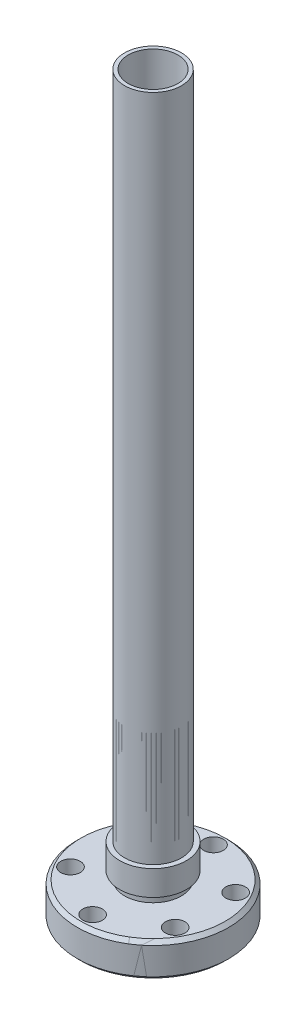
ISO-10303-21;
HEADER;
FILE_DESCRIPTION(('STEP AP214'),'2;1');
FILE_NAME('part.step','',(''),(''),'','','');
FILE_SCHEMA(('AUTOMOTIVE_DESIGN { 1 0 10303 214 1 1 1 1 }'));
ENDSEC;
DATA;
#1=APPLICATION_CONTEXT('core data for automotive mechanical design processes');
#2=APPLICATION_PROTOCOL_DEFINITION('international standard','automotive_design',2000,#1);
#3=PRODUCT_CONTEXT('',#1,'mechanical');
#4=PRODUCT('Part','Part','',(#3));
#5=PRODUCT_RELATED_PRODUCT_CATEGORY('part','',(#4));
#6=PRODUCT_DEFINITION_FORMATION('','',#4);
#7=PRODUCT_DEFINITION_CONTEXT('part definition',#1,'design');
#8=PRODUCT_DEFINITION('design','',#6,#7);
#9=PRODUCT_DEFINITION_SHAPE('','',#8);
#10=(LENGTH_UNIT() NAMED_UNIT(*) SI_UNIT(.MILLI.,.METRE.));
#11=(NAMED_UNIT(*) PLANE_ANGLE_UNIT() SI_UNIT($,.RADIAN.));
#12=(NAMED_UNIT(*) SI_UNIT($,.STERADIAN.) SOLID_ANGLE_UNIT());
#13=UNCERTAINTY_MEASURE_WITH_UNIT(LENGTH_MEASURE(1.E-05),#10,'distance_accuracy_value','');
#14=(GEOMETRIC_REPRESENTATION_CONTEXT(3) GLOBAL_UNCERTAINTY_ASSIGNED_CONTEXT((#13)) GLOBAL_UNIT_ASSIGNED_CONTEXT((#10,
#11,#12)) REPRESENTATION_CONTEXT('',''));
#15=CARTESIAN_POINT('',(0.,0.,0.));
#16=DIRECTION('',(0.,0.,1.));
#17=DIRECTION('',(1.,0.,0.));
#18=AXIS2_PLACEMENT_3D('',#15,#16,#17);
#19=CARTESIAN_POINT('',(0.,164.2364,1.72028497727633E-12));
#20=DIRECTION('',(0.,-1.,0.));
#21=DIRECTION('',(-1.,0.,0.));
#22=AXIS2_PLACEMENT_3D('',#19,#20,#21);
#23=CYLINDRICAL_SURFACE('',#22,6.35);
#24=CARTESIAN_POINT('',(0.,15.0114,1.57236068909729E-13));
#25=DIRECTION('',(0.,1.,0.));
#26=DIRECTION('',(0.,0.,1.));
#27=AXIS2_PLACEMENT_3D('',#24,#25,#26);
#28=CIRCLE('',#27,6.35);
#29=CARTESIAN_POINT('',(0.,15.0114,6.35000000000016));
#30=VERTEX_POINT('',#29);
#31=EDGE_CURVE('P0_E13',#30,#30,#28,.T.);
#32=ORIENTED_EDGE('',*,*,#31,.T.);
#33=EDGE_LOOP('',(#32));
#34=FACE_BOUND('',#33,.T.);
#35=CARTESIAN_POINT('',(0.,40.4114,4.23286946929577E-13));
#36=DIRECTION('',(0.,1.,0.));
#37=DIRECTION('',(0.,0.,1.));
#38=AXIS2_PLACEMENT_3D('',#35,#36,#37);
#39=CIRCLE('',#38,6.35);
#40=CARTESIAN_POINT('',(0.,40.4114,6.35000000000042));
#41=VERTEX_POINT('',#40);
#42=EDGE_CURVE('P0_E206',#41,#41,#39,.F.);
#43=ORIENTED_EDGE('',*,*,#42,.T.);
#44=EDGE_LOOP('',(#43));
#45=FACE_BOUND('',#44,.T.);
#46=ADVANCED_FACE('P0_F52',(#34,#45),#23,.T.);
#47=CARTESIAN_POINT('',(0.,164.2364,1.72028497727633E-12));
#48=DIRECTION('',(0.,-1.,0.));
#49=DIRECTION('',(-1.,0.,0.));
#50=AXIS2_PLACEMENT_3D('',#47,#48,#49);
#51=CYLINDRICAL_SURFACE('',#50,5.5372);
#52=CARTESIAN_POINT('',(0.,11.8364,1.23979709157249E-13));
#53=DIRECTION('',(0.,1.,0.));
#54=DIRECTION('',(1.,0.,0.));
#55=AXIS2_PLACEMENT_3D('',#52,#53,#54);
#56=CIRCLE('',#55,5.5372);
#57=CARTESIAN_POINT('',(5.5372,11.8364,1.23979709157249E-13));
#58=VERTEX_POINT('',#57);
#59=EDGE_CURVE('P0_E225',#58,#58,#56,.T.);
#60=ORIENTED_EDGE('',*,*,#59,.F.);
#61=EDGE_LOOP('',(#60));
#62=FACE_BOUND('',#61,.T.);
#63=CARTESIAN_POINT('',(0.,40.4114,4.23286946929577E-13));
#64=DIRECTION('',(0.,1.,0.));
#65=DIRECTION('',(0.,0.,1.));
#66=AXIS2_PLACEMENT_3D('',#63,#64,#65);
#67=CIRCLE('',#66,5.5372);
#68=CARTESIAN_POINT('',(0.,40.4114,5.53720000000042));
#69=VERTEX_POINT('',#68);
#70=EDGE_CURVE('P0_E56',#69,#69,#67,.F.);
#71=ORIENTED_EDGE('',*,*,#70,.F.);
#72=EDGE_LOOP('',(#71));
#73=FACE_BOUND('',#72,.T.);
#74=ADVANCED_FACE('P0_F326',(#62,#73),#51,.F.);
#75=CARTESIAN_POINT('',(6.4135,15.0114,0.));
#76=DIRECTION('',(0.,1.,0.));
#77=DIRECTION('',(1.,0.,0.));
#78=AXIS2_PLACEMENT_3D('',#75,#76,#77);
#79=PLANE('',#78);
#80=CARTESIAN_POINT('',(0.,15.0114,0.));
#81=DIRECTION('',(0.,1.,0.));
#82=DIRECTION('',(0.,0.,1.));
#83=AXIS2_PLACEMENT_3D('',#80,#81,#82);
#84=CIRCLE('',#83,7.4295);
#85=CARTESIAN_POINT('',(0.,15.0114,7.4295));
#86=VERTEX_POINT('',#85);
#87=EDGE_CURVE('P0_E63',#86,#86,#84,.T.);
#88=ORIENTED_EDGE('',*,*,#87,.T.);
#89=EDGE_LOOP('',(#88));
#90=FACE_BOUND('',#89,.T.);
#91=ORIENTED_EDGE('',*,*,#31,.F.);
#92=EDGE_LOOP('',(#91));
#93=FACE_BOUND('',#92,.T.);
#94=ADVANCED_FACE('P0_F332',(#90,#93),#79,.T.);
#95=CARTESIAN_POINT('',(0.,36.0251993233018,0.));
#96=DIRECTION('',(0.,-1.,0.));
#97=DIRECTION('',(0.,0.,-1.));
#98=AXIS2_PLACEMENT_3D('',#95,#96,#97);
#99=CYLINDRICAL_SURFACE('',#98,7.4295);
#100=CARTESIAN_POINT('',(0.,9.4234,0.));
#101=DIRECTION('',(0.,-1.,0.));
#102=DIRECTION('',(0.,0.,-1.));
#103=AXIS2_PLACEMENT_3D('',#100,#101,#102);
#104=CIRCLE('',#103,7.4295);
#105=CARTESIAN_POINT('',(0.,9.4234,-7.4295));
#106=VERTEX_POINT('',#105);
#107=EDGE_CURVE('P0_E200',#106,#106,#104,.T.);
#108=ORIENTED_EDGE('',*,*,#107,.F.);
#109=EDGE_LOOP('',(#108));
#110=FACE_BOUND('',#109,.T.);
#111=ORIENTED_EDGE('',*,*,#87,.F.);
#112=EDGE_LOOP('',(#111));
#113=FACE_BOUND('',#112,.T.);
#114=ADVANCED_FACE('P0_F201',(#110,#113),#99,.T.);
#115=CARTESIAN_POINT('',(5.3975,11.8364,0.));
#116=DIRECTION('',(0.,1.,0.));
#117=DIRECTION('',(1.,0.,0.));
#118=AXIS2_PLACEMENT_3D('',#115,#116,#117);
#119=PLANE('',#118);
#120=ORIENTED_EDGE('',*,*,#59,.T.);
#121=EDGE_LOOP('',(#120));
#122=FACE_BOUND('',#121,.T.);
#123=CARTESIAN_POINT('',(0.,11.8364,0.));
#124=DIRECTION('',(0.,-1.,0.));
#125=DIRECTION('',(0.,0.,-1.));
#126=AXIS2_PLACEMENT_3D('',#123,#124,#125);
#127=CIRCLE('',#126,5.3975);
#128=CARTESIAN_POINT('',(0.,11.8364,-5.3975));
#129=VERTEX_POINT('',#128);
#130=EDGE_CURVE('P0_E224',#129,#129,#127,.T.);
#131=ORIENTED_EDGE('',*,*,#130,.T.);
#132=EDGE_LOOP('',(#131));
#133=FACE_BOUND('',#132,.T.);
#134=ADVANCED_FACE('P0_F339',(#122,#133),#119,.T.);
#135=CARTESIAN_POINT('',(0.,-8.49931016623051,0.));
#136=DIRECTION('',(0.,-1.,0.));
#137=DIRECTION('',(0.,0.,-1.));
#138=AXIS2_PLACEMENT_3D('',#135,#136,#137);
#139=CYLINDRICAL_SURFACE('',#138,9.144);
#140=CARTESIAN_POINT('',(0.,0.6604,0.));
#141=DIRECTION('',(0.,-1.,0.));
#142=DIRECTION('',(0.,0.,-1.));
#143=AXIS2_PLACEMENT_3D('',#140,#141,#142);
#144=CIRCLE('',#143,9.144);
#145=CARTESIAN_POINT('',(0.,0.6604,-9.144));
#146=VERTEX_POINT('',#145);
#147=EDGE_CURVE('P0_E220',#146,#146,#144,.T.);
#148=ORIENTED_EDGE('',*,*,#147,.T.);
#149=EDGE_LOOP('',(#148));
#150=FACE_BOUND('',#149,.T.);
#151=CARTESIAN_POINT('',(0.,1.1684,0.));
#152=DIRECTION('',(0.,-1.,0.));
#153=DIRECTION('',(0.,0.,-1.));
#154=AXIS2_PLACEMENT_3D('',#151,#152,#153);
#155=CIRCLE('',#154,9.144);
#156=CARTESIAN_POINT('',(0.,1.1684,-9.144));
#157=VERTEX_POINT('',#156);
#158=EDGE_CURVE('P0_E263',#157,#157,#155,.T.);
#159=ORIENTED_EDGE('',*,*,#158,.F.);
#160=EDGE_LOOP('',(#159));
#161=FACE_BOUND('',#160,.T.);
#162=ADVANCED_FACE('P0_F341',(#150,#161),#139,.F.);
#163=CARTESIAN_POINT('',(0.,1.22433548097206,0.));
#164=DIRECTION('',(0.,1.,0.));
#165=DIRECTION('',(0.,0.,1.));
#166=AXIS2_PLACEMENT_3D('',#163,#164,#165);
#167=CONICAL_SURFACE('',#166,10.6934,1.22173047639603);
#168=CARTESIAN_POINT('',(0.,1.22433548097206,0.));
#169=DIRECTION('',(0.,-1.,0.));
#170=DIRECTION('',(0.,0.,-1.));
#171=AXIS2_PLACEMENT_3D('',#168,#169,#170);
#172=CIRCLE('',#171,10.6934);
#173=CARTESIAN_POINT('',(0.,1.22433548097206,-10.6934));
#174=VERTEX_POINT('',#173);
#175=EDGE_CURVE('P0_E154',#174,#174,#172,.T.);
#176=ORIENTED_EDGE('',*,*,#175,.T.);
#177=EDGE_LOOP('',(#176));
#178=FACE_BOUND('',#177,.T.);
#179=ORIENTED_EDGE('',*,*,#147,.F.);
#180=EDGE_LOOP('',(#179));
#181=FACE_BOUND('',#180,.T.);
#182=ADVANCED_FACE('P0_F408',(#178,#181),#167,.T.);
#183=CARTESIAN_POINT('',(0.,-8.49931016623051,0.));
#184=DIRECTION('',(0.,-1.,0.));
#185=DIRECTION('',(0.,0.,-1.));
#186=AXIS2_PLACEMENT_3D('',#183,#184,#185);
#187=CYLINDRICAL_SURFACE('',#186,10.6934);
#188=CARTESIAN_POINT('',(0.,0.,0.));
#189=DIRECTION('',(0.,-1.,0.));
#190=DIRECTION('',(0.,0.,-1.));
#191=AXIS2_PLACEMENT_3D('',#188,#189,#190);
#192=CIRCLE('',#191,10.6934);
#193=CARTESIAN_POINT('',(0.,0.,-10.6934));
#194=VERTEX_POINT('',#193);
#195=EDGE_CURVE('P0_E163',#194,#194,#192,.T.);
#196=ORIENTED_EDGE('',*,*,#195,.T.);
#197=EDGE_LOOP('',(#196));
#198=FACE_BOUND('',#197,.T.);
#199=ORIENTED_EDGE('',*,*,#175,.F.);
#200=EDGE_LOOP('',(#199));
#201=FACE_BOUND('',#200,.T.);
#202=ADVANCED_FACE('P0_F371',(#198,#201),#187,.F.);
#203=CARTESIAN_POINT('',(-10.6934,0.,0.));
#204=DIRECTION('',(0.,1.,0.));
#205=DIRECTION('',(1.,0.,0.));
#206=AXIS2_PLACEMENT_3D('',#203,#204,#205);
#207=PLANE('',#206);
#208=CARTESIAN_POINT('',(0.,0.,0.));
#209=DIRECTION('',(0.,-1.,0.));
#210=DIRECTION('',(0.,0.,1.));
#211=AXIS2_PLACEMENT_3D('',#208,#209,#210);
#212=CIRCLE('',#211,16.1036);
#213=CARTESIAN_POINT('',(0.,0.,16.1036));
#214=VERTEX_POINT('',#213);
#215=EDGE_CURVE('P0_E239',#214,#214,#212,.T.);
#216=ORIENTED_EDGE('',*,*,#215,.T.);
#217=EDGE_LOOP('',(#216));
#218=FACE_BOUND('',#217,.T.);
#219=CARTESIAN_POINT('',(11.6804310310022,0.,-6.74370000000013));
#220=DIRECTION('',(0.,-1.,0.));
#221=DIRECTION('',(0.866025403784433,0.,-0.50000000000001));
#222=AXIS2_PLACEMENT_3D('',#219,#220,#221);
#223=CIRCLE('',#222,2.1844);
#224=CARTESIAN_POINT('',(13.5721769230289,0.,-7.83590000000015));
#225=VERTEX_POINT('',#224);
#226=EDGE_CURVE('P0_E295',#225,#225,#223,.T.);
#227=ORIENTED_EDGE('',*,*,#226,.F.);
#228=EDGE_LOOP('',(#227));
#229=FACE_BOUND('',#228,.T.);
#230=CARTESIAN_POINT('',(11.6804310310023,0.,6.74369999999989));
#231=DIRECTION('',(0.,-1.,0.));
#232=DIRECTION('',(0.866025403784444,0.,0.499999999999992));
#233=AXIS2_PLACEMENT_3D('',#230,#231,#232);
#234=CIRCLE('',#233,2.1844);
#235=CARTESIAN_POINT('',(13.572176923029,0.,7.83589999999988));
#236=VERTEX_POINT('',#235);
#237=EDGE_CURVE('P0_E281',#236,#236,#234,.T.);
#238=ORIENTED_EDGE('',*,*,#237,.F.);
#239=EDGE_LOOP('',(#238));
#240=FACE_BOUND('',#239,.T.);
#241=CARTESIAN_POINT('',(0.,0.,13.4874));
#242=DIRECTION('',(0.,-1.,0.));
#243=DIRECTION('',(0.,0.,1.));
#244=AXIS2_PLACEMENT_3D('',#241,#242,#243);
#245=CIRCLE('',#244,2.1844);
#246=CARTESIAN_POINT('',(1.07783864368282E-13,0.,15.6718));
#247=VERTEX_POINT('',#246);
#248=EDGE_CURVE('P0_E254',#247,#247,#245,.T.);
#249=ORIENTED_EDGE('',*,*,#248,.F.);
#250=EDGE_LOOP('',(#249));
#251=FACE_BOUND('',#250,.T.);
#252=CARTESIAN_POINT('',(-11.6804310310022,0.,6.7437));
#253=DIRECTION('',(0.,-1.,0.));
#254=DIRECTION('',(-0.866025403784437,0.,0.5));
#255=AXIS2_PLACEMENT_3D('',#252,#253,#254);
#256=CIRCLE('',#255,2.1844);
#257=CARTESIAN_POINT('',(-13.5721769230289,0.,7.8359));
#258=VERTEX_POINT('',#257);
#259=EDGE_CURVE('P0_E249',#258,#258,#256,.T.);
#260=ORIENTED_EDGE('',*,*,#259,.F.);
#261=EDGE_LOOP('',(#260));
#262=FACE_BOUND('',#261,.T.);
#263=CARTESIAN_POINT('',(-11.6804310310023,0.,-6.7437));
#264=DIRECTION('',(0.,-1.,0.));
#265=DIRECTION('',(-0.86602540378444,0.,-0.5));
#266=AXIS2_PLACEMENT_3D('',#263,#264,#265);
#267=CIRCLE('',#266,2.1844);
#268=CARTESIAN_POINT('',(-13.572176923029,0.,-7.8359));
#269=VERTEX_POINT('',#268);
#270=EDGE_CURVE('P0_E253',#269,#269,#267,.T.);
#271=ORIENTED_EDGE('',*,*,#270,.F.);
#272=EDGE_LOOP('',(#271));
#273=FACE_BOUND('',#272,.T.);
#274=CARTESIAN_POINT('',(0.,0.,-13.4874));
#275=DIRECTION('',(0.,-1.,0.));
#276=DIRECTION('',(0.,0.,-1.));
#277=AXIS2_PLACEMENT_3D('',#274,#275,#276);
#278=CIRCLE('',#277,2.1844);
#279=CARTESIAN_POINT('',(0.,0.,-15.6718));
#280=VERTEX_POINT('',#279);
#281=EDGE_CURVE('P0_E260',#280,#280,#278,.T.);
#282=ORIENTED_EDGE('',*,*,#281,.F.);
#283=EDGE_LOOP('',(#282));
#284=FACE_BOUND('',#283,.T.);
#285=ORIENTED_EDGE('',*,*,#195,.F.);
#286=EDGE_LOOP('',(#285));
#287=FACE_BOUND('',#286,.T.);
#288=ADVANCED_FACE('P0_F368',(#218,#229,#240,#251,#262,#273,#284,#287),#207,.F.);
#289=CARTESIAN_POINT('',(0.,-8.49931016623051,0.));
#290=DIRECTION('',(0.,-1.,0.));
#291=DIRECTION('',(0.,0.,-1.));
#292=AXIS2_PLACEMENT_3D('',#289,#290,#291);
#293=CYLINDRICAL_SURFACE('',#292,16.891);
#294=CARTESIAN_POINT('',(0.,0.7874,0.));
#295=DIRECTION('',(0.,1.,0.));
#296=DIRECTION('',(0.,0.,1.));
#297=AXIS2_PLACEMENT_3D('',#294,#295,#296);
#298=CIRCLE('',#297,16.891);
#299=CARTESIAN_POINT('',(0.,0.7874,16.891));
#300=VERTEX_POINT('',#299);
#301=EDGE_CURVE('P0_E245',#300,#300,#298,.T.);
#302=ORIENTED_EDGE('',*,*,#301,.T.);
#303=EDGE_LOOP('',(#302));
#304=FACE_BOUND('',#303,.T.);
#305=CARTESIAN_POINT('',(0.,6.8326,0.));
#306=DIRECTION('',(0.,-1.,0.));
#307=DIRECTION('',(0.,0.,-1.));
#308=AXIS2_PLACEMENT_3D('',#305,#306,#307);
#309=CIRCLE('',#308,16.891);
#310=CARTESIAN_POINT('',(0.,6.8326,-16.891));
#311=VERTEX_POINT('',#310);
#312=EDGE_CURVE('P0_E233',#311,#311,#309,.T.);
#313=ORIENTED_EDGE('',*,*,#312,.T.);
#314=EDGE_LOOP('',(#313));
#315=FACE_BOUND('',#314,.T.);
#316=ADVANCED_FACE('P0_F320',(#304,#315),#293,.T.);
#317=CARTESIAN_POINT('',(0.,7.62,0.));
#318=DIRECTION('',(0.,-1.,0.));
#319=DIRECTION('',(0.,0.,-1.));
#320=AXIS2_PLACEMENT_3D('',#317,#318,#319);
#321=PLANE('',#320);
#322=CARTESIAN_POINT('',(0.,7.62,0.));
#323=DIRECTION('',(0.,1.,0.));
#324=DIRECTION('',(0.,0.,-1.));
#325=AXIS2_PLACEMENT_3D('',#322,#323,#324);
#326=CIRCLE('',#325,16.1036);
#327=CARTESIAN_POINT('',(0.,7.62,-16.1036));
#328=VERTEX_POINT('',#327);
#329=EDGE_CURVE('P0_E229',#328,#328,#326,.T.);
#330=ORIENTED_EDGE('',*,*,#329,.T.);
#331=EDGE_LOOP('',(#330));
#332=FACE_BOUND('',#331,.T.);
#333=CARTESIAN_POINT('',(0.,7.62,0.));
#334=DIRECTION('',(0.,-1.,0.));
#335=DIRECTION('',(0.,0.,-1.));
#336=AXIS2_PLACEMENT_3D('',#333,#334,#335);
#337=CIRCLE('',#336,6.3119);
#338=CARTESIAN_POINT('',(0.,7.62,-6.3119));
#339=VERTEX_POINT('',#338);
#340=EDGE_CURVE('P0_E191',#339,#339,#337,.T.);
#341=ORIENTED_EDGE('',*,*,#340,.T.);
#342=EDGE_LOOP('',(#341));
#343=FACE_BOUND('',#342,.T.);
#344=CARTESIAN_POINT('',(11.6804310310022,7.62,-6.74370000000013));
#345=DIRECTION('',(0.,-1.,0.));
#346=DIRECTION('',(0.866025403784433,0.,-0.50000000000001));
#347=AXIS2_PLACEMENT_3D('',#344,#345,#346);
#348=CIRCLE('',#347,2.1844);
#349=CARTESIAN_POINT('',(13.5721769230289,7.62,-7.83590000000015));
#350=VERTEX_POINT('',#349);
#351=EDGE_CURVE('P0_E182',#350,#350,#348,.T.);
#352=ORIENTED_EDGE('',*,*,#351,.T.);
#353=EDGE_LOOP('',(#352));
#354=FACE_BOUND('',#353,.T.);
#355=CARTESIAN_POINT('',(11.6804310310023,7.62,6.74369999999989));
#356=DIRECTION('',(0.,-1.,0.));
#357=DIRECTION('',(0.866025403784444,0.,0.499999999999992));
#358=AXIS2_PLACEMENT_3D('',#355,#356,#357);
#359=CIRCLE('',#358,2.1844);
#360=CARTESIAN_POINT('',(13.572176923029,7.62,7.83589999999988));
#361=VERTEX_POINT('',#360);
#362=EDGE_CURVE('P0_E217',#361,#361,#359,.T.);
#363=ORIENTED_EDGE('',*,*,#362,.T.);
#364=EDGE_LOOP('',(#363));
#365=FACE_BOUND('',#364,.T.);
#366=CARTESIAN_POINT('',(0.,7.62,13.4874));
#367=DIRECTION('',(0.,-1.,0.));
#368=DIRECTION('',(0.,0.,1.));
#369=AXIS2_PLACEMENT_3D('',#366,#367,#368);
#370=CIRCLE('',#369,2.1844);
#371=CARTESIAN_POINT('',(1.07783864368282E-13,7.62,15.6718));
#372=VERTEX_POINT('',#371);
#373=EDGE_CURVE('P0_E118',#372,#372,#370,.T.);
#374=ORIENTED_EDGE('',*,*,#373,.T.);
#375=EDGE_LOOP('',(#374));
#376=FACE_BOUND('',#375,.T.);
#377=CARTESIAN_POINT('',(-11.6804310310022,7.62,6.7437));
#378=DIRECTION('',(0.,-1.,0.));
#379=DIRECTION('',(-0.866025403784437,0.,0.5));
#380=AXIS2_PLACEMENT_3D('',#377,#378,#379);
#381=CIRCLE('',#380,2.1844);
#382=CARTESIAN_POINT('',(-13.5721769230289,7.62,7.8359));
#383=VERTEX_POINT('',#382);
#384=EDGE_CURVE('P0_E109',#383,#383,#381,.T.);
#385=ORIENTED_EDGE('',*,*,#384,.T.);
#386=EDGE_LOOP('',(#385));
#387=FACE_BOUND('',#386,.T.);
#388=CARTESIAN_POINT('',(-11.6804310310023,7.62,-6.7437));
#389=DIRECTION('',(0.,-1.,0.));
#390=DIRECTION('',(-0.86602540378444,0.,-0.5));
#391=AXIS2_PLACEMENT_3D('',#388,#389,#390);
#392=CIRCLE('',#391,2.1844);
#393=CARTESIAN_POINT('',(-13.572176923029,7.62,-7.8359));
#394=VERTEX_POINT('',#393);
#395=EDGE_CURVE('P0_E240',#394,#394,#392,.T.);
#396=ORIENTED_EDGE('',*,*,#395,.T.);
#397=EDGE_LOOP('',(#396));
#398=FACE_BOUND('',#397,.T.);
#399=CARTESIAN_POINT('',(0.,7.62,-13.4874));
#400=DIRECTION('',(0.,-1.,0.));
#401=DIRECTION('',(0.,0.,-1.));
#402=AXIS2_PLACEMENT_3D('',#399,#400,#401);
#403=CIRCLE('',#402,2.1844);
#404=CARTESIAN_POINT('',(0.,7.62,-15.6718));
#405=VERTEX_POINT('',#404);
#406=EDGE_CURVE('P0_E244',#405,#405,#403,.T.);
#407=ORIENTED_EDGE('',*,*,#406,.T.);
#408=EDGE_LOOP('',(#407));
#409=FACE_BOUND('',#408,.T.);
#410=ADVANCED_FACE('P0_F308',(#332,#343,#354,#365,#376,#387,#398,#409),#321,.F.);
#411=CARTESIAN_POINT('',(0.,1.1684,0.));
#412=DIRECTION('',(0.,1.,0.));
#413=DIRECTION('',(1.,0.,0.));
#414=AXIS2_PLACEMENT_3D('',#411,#412,#413);
#415=PLANE('',#414);
#416=ORIENTED_EDGE('',*,*,#158,.T.);
#417=EDGE_LOOP('',(#416));
#418=FACE_BOUND('',#417,.T.);
#419=CARTESIAN_POINT('',(0.,1.1684,0.));
#420=DIRECTION('',(0.,-1.,0.));
#421=DIRECTION('',(0.,0.,-1.));
#422=AXIS2_PLACEMENT_3D('',#419,#420,#421);
#423=CIRCLE('',#422,5.3975);
#424=CARTESIAN_POINT('',(0.,1.1684,-5.3975));
#425=VERTEX_POINT('',#424);
#426=EDGE_CURVE('P0_E212',#425,#425,#423,.T.);
#427=ORIENTED_EDGE('',*,*,#426,.F.);
#428=EDGE_LOOP('',(#427));
#429=FACE_BOUND('',#428,.T.);
#430=ADVANCED_FACE('P0_F305',(#418,#429),#415,.F.);
#431=CARTESIAN_POINT('',(0.,7.62,-13.4874));
#432=DIRECTION('',(0.,-1.,0.));
#433=DIRECTION('',(0.,0.,-1.));
#434=AXIS2_PLACEMENT_3D('',#431,#432,#433);
#435=CYLINDRICAL_SURFACE('',#434,2.1844);
#436=ORIENTED_EDGE('',*,*,#281,.T.);
#437=EDGE_LOOP('',(#436));
#438=FACE_BOUND('',#437,.T.);
#439=ORIENTED_EDGE('',*,*,#406,.F.);
#440=EDGE_LOOP('',(#439));
#441=FACE_BOUND('',#440,.T.);
#442=ADVANCED_FACE('P0_F307',(#438,#441),#435,.F.);
#443=CARTESIAN_POINT('',(-11.6804310310023,7.62,-6.7437));
#444=DIRECTION('',(0.,-1.,0.));
#445=DIRECTION('',(0.,0.,-1.));
#446=AXIS2_PLACEMENT_3D('',#443,#444,#445);
#447=CYLINDRICAL_SURFACE('',#446,2.1844);
#448=ORIENTED_EDGE('',*,*,#270,.T.);
#449=EDGE_LOOP('',(#448));
#450=FACE_BOUND('',#449,.T.);
#451=ORIENTED_EDGE('',*,*,#395,.F.);
#452=EDGE_LOOP('',(#451));
#453=FACE_BOUND('',#452,.T.);
#454=ADVANCED_FACE('P0_F316',(#450,#453),#447,.F.);
#455=CARTESIAN_POINT('',(-11.6804310310022,7.62,6.7437));
#456=DIRECTION('',(0.,-1.,0.));
#457=DIRECTION('',(0.,0.,-1.));
#458=AXIS2_PLACEMENT_3D('',#455,#456,#457);
#459=CYLINDRICAL_SURFACE('',#458,2.1844);
#460=ORIENTED_EDGE('',*,*,#259,.T.);
#461=EDGE_LOOP('',(#460));
#462=FACE_BOUND('',#461,.T.);
#463=ORIENTED_EDGE('',*,*,#384,.F.);
#464=EDGE_LOOP('',(#463));
#465=FACE_BOUND('',#464,.T.);
#466=ADVANCED_FACE('P0_F386',(#462,#465),#459,.F.);
#467=CARTESIAN_POINT('',(0.,7.62,13.4874));
#468=DIRECTION('',(0.,-1.,0.));
#469=DIRECTION('',(0.,0.,-1.));
#470=AXIS2_PLACEMENT_3D('',#467,#468,#469);
#471=CYLINDRICAL_SURFACE('',#470,2.1844);
#472=ORIENTED_EDGE('',*,*,#248,.T.);
#473=EDGE_LOOP('',(#472));
#474=FACE_BOUND('',#473,.T.);
#475=ORIENTED_EDGE('',*,*,#373,.F.);
#476=EDGE_LOOP('',(#475));
#477=FACE_BOUND('',#476,.T.);
#478=ADVANCED_FACE('P0_F391',(#474,#477),#471,.F.);
#479=CARTESIAN_POINT('',(11.6804310310023,7.62,6.74369999999989));
#480=DIRECTION('',(0.,-1.,0.));
#481=DIRECTION('',(0.,0.,-1.));
#482=AXIS2_PLACEMENT_3D('',#479,#480,#481);
#483=CYLINDRICAL_SURFACE('',#482,2.1844);
#484=ORIENTED_EDGE('',*,*,#237,.T.);
#485=EDGE_LOOP('',(#484));
#486=FACE_BOUND('',#485,.T.);
#487=ORIENTED_EDGE('',*,*,#362,.F.);
#488=EDGE_LOOP('',(#487));
#489=FACE_BOUND('',#488,.T.);
#490=ADVANCED_FACE('P0_F396',(#486,#489),#483,.F.);
#491=CARTESIAN_POINT('',(11.6804310310022,7.62,-6.74370000000013));
#492=DIRECTION('',(0.,-1.,0.));
#493=DIRECTION('',(0.,0.,-1.));
#494=AXIS2_PLACEMENT_3D('',#491,#492,#493);
#495=CYLINDRICAL_SURFACE('',#494,2.1844);
#496=ORIENTED_EDGE('',*,*,#226,.T.);
#497=EDGE_LOOP('',(#496));
#498=FACE_BOUND('',#497,.T.);
#499=ORIENTED_EDGE('',*,*,#351,.F.);
#500=EDGE_LOOP('',(#499));
#501=FACE_BOUND('',#500,.T.);
#502=ADVANCED_FACE('P0_F364',(#498,#501),#495,.F.);
#503=CARTESIAN_POINT('',(0.,6.8326,0.));
#504=DIRECTION('',(0.,-1.,0.));
#505=DIRECTION('',(0.,0.,-1.));
#506=AXIS2_PLACEMENT_3D('',#503,#504,#505);
#507=CONICAL_SURFACE('',#506,16.891,0.785398163397453);
#508=ORIENTED_EDGE('',*,*,#312,.F.);
#509=EDGE_LOOP('',(#508));
#510=FACE_BOUND('',#509,.T.);
#511=ORIENTED_EDGE('',*,*,#329,.F.);
#512=EDGE_LOOP('',(#511));
#513=FACE_BOUND('',#512,.T.);
#514=ADVANCED_FACE('P0_F338',(#510,#513),#507,.T.);
#515=CARTESIAN_POINT('',(0.,0.,0.));
#516=DIRECTION('',(0.,1.,0.));
#517=DIRECTION('',(0.,0.,1.));
#518=AXIS2_PLACEMENT_3D('',#515,#516,#517);
#519=CONICAL_SURFACE('',#518,16.1036,0.785398163397448);
#520=ORIENTED_EDGE('',*,*,#301,.F.);
#521=EDGE_LOOP('',(#520));
#522=FACE_BOUND('',#521,.T.);
#523=ORIENTED_EDGE('',*,*,#215,.F.);
#524=EDGE_LOOP('',(#523));
#525=FACE_BOUND('',#524,.T.);
#526=ADVANCED_FACE('P0_F355',(#522,#525),#519,.T.);
#527=CARTESIAN_POINT('',(0.,25.5805122421383,0.));
#528=DIRECTION('',(0.,-1.,0.));
#529=DIRECTION('',(0.,0.,-1.));
#530=AXIS2_PLACEMENT_3D('',#527,#528,#529);
#531=CYLINDRICAL_SURFACE('',#530,5.3975);
#532=ORIENTED_EDGE('',*,*,#130,.F.);
#533=EDGE_LOOP('',(#532));
#534=FACE_BOUND('',#533,.T.);
#535=ORIENTED_EDGE('',*,*,#426,.T.);
#536=EDGE_LOOP('',(#535));
#537=FACE_BOUND('',#536,.T.);
#538=ADVANCED_FACE('P0_F303',(#534,#537),#531,.F.);
#539=CARTESIAN_POINT('',(0.,1.1684,0.));
#540=DIRECTION('',(0.,-1.,0.));
#541=DIRECTION('',(0.,0.,-1.));
#542=AXIS2_PLACEMENT_3D('',#539,#540,#541);
#543=CYLINDRICAL_SURFACE('',#542,6.3119);
#544=ORIENTED_EDGE('',*,*,#340,.F.);
#545=EDGE_LOOP('',(#544));
#546=FACE_BOUND('',#545,.T.);
#547=CARTESIAN_POINT('',(0.,9.4234,0.));
#548=DIRECTION('',(0.,-1.,0.));
#549=DIRECTION('',(0.,0.,-1.));
#550=AXIS2_PLACEMENT_3D('',#547,#548,#549);
#551=CIRCLE('',#550,6.3119);
#552=CARTESIAN_POINT('',(0.,9.4234,-6.3119));
#553=VERTEX_POINT('',#552);
#554=EDGE_CURVE('P0_E205',#553,#553,#551,.T.);
#555=ORIENTED_EDGE('',*,*,#554,.T.);
#556=EDGE_LOOP('',(#555));
#557=FACE_BOUND('',#556,.T.);
#558=ADVANCED_FACE('P0_F361',(#546,#557),#543,.T.);
#559=CARTESIAN_POINT('',(7.4295,9.4234,0.));
#560=DIRECTION('',(0.,-1.,0.));
#561=DIRECTION('',(0.,0.,-1.));
#562=AXIS2_PLACEMENT_3D('',#559,#560,#561);
#563=PLANE('',#562);
#564=ORIENTED_EDGE('',*,*,#107,.T.);
#565=EDGE_LOOP('',(#564));
#566=FACE_BOUND('',#565,.T.);
#567=ORIENTED_EDGE('',*,*,#554,.F.);
#568=EDGE_LOOP('',(#567));
#569=FACE_BOUND('',#568,.T.);
#570=ADVANCED_FACE('P0_F54',(#566,#569),#563,.T.);
#571=CARTESIAN_POINT('',(6.4135,40.4114,0.));
#572=DIRECTION('',(0.,1.,0.));
#573=DIRECTION('',(1.,0.,0.));
#574=AXIS2_PLACEMENT_3D('',#571,#572,#573);
#575=PLANE('',#574);
#576=ORIENTED_EDGE('',*,*,#42,.F.);
#577=EDGE_LOOP('',(#576));
#578=FACE_BOUND('',#577,.T.);
#579=ORIENTED_EDGE('',*,*,#70,.T.);
#580=EDGE_LOOP('',(#579));
#581=FACE_BOUND('',#580,.T.);
#582=ADVANCED_FACE('P0_F416',(#578,#581),#575,.T.);
#583=CLOSED_SHELL('',(#46,#74,#94,#114,#134,#162,#182,#202,#288,#316,#410,#430,#442,#454,#466,
#478,#490,#502,#514,#526,#538,#558,#570,#582));
#584=MANIFOLD_SOLID_BREP('P0_B2',#583);
#585=CARTESIAN_POINT('',(0.,164.2364,1.72028497727633E-12));
#586=DIRECTION('',(0.,1.,0.));
#587=DIRECTION('',(0.,0.,-1.));
#588=AXIS2_PLACEMENT_3D('',#585,#586,#587);
#589=PLANE('',#588);
#590=CARTESIAN_POINT('',(0.,164.2364,1.72028497727633E-12));
#591=DIRECTION('',(0.,1.,0.));
#592=DIRECTION('',(1.,0.,0.));
#593=AXIS2_PLACEMENT_3D('',#590,#591,#592);
#594=CIRCLE('',#593,6.35);
#595=CARTESIAN_POINT('',(6.35,164.2364,1.72028497727633E-12));
#596=VERTEX_POINT('',#595);
#597=EDGE_CURVE('P1_E12',#596,#596,#594,.T.);
#598=ORIENTED_EDGE('',*,*,#597,.T.);
#599=EDGE_LOOP('',(#598));
#600=FACE_BOUND('',#599,.T.);
#601=CARTESIAN_POINT('',(0.,164.2364,1.72028497727633E-12));
#602=DIRECTION('',(0.,1.,0.));
#603=DIRECTION('',(1.,0.,0.));
#604=AXIS2_PLACEMENT_3D('',#601,#602,#603);
#605=CIRCLE('',#604,5.5372);
#606=CARTESIAN_POINT('',(5.5372,164.2364,1.72028497727633E-12));
#607=VERTEX_POINT('',#606);
#608=EDGE_CURVE('P1_E222',#607,#607,#605,.T.);
#609=ORIENTED_EDGE('',*,*,#608,.F.);
#610=EDGE_LOOP('',(#609));
#611=FACE_BOUND('',#610,.T.);
#612=ADVANCED_FACE('P1_F18',(#600,#611),#589,.T.);
#613=CARTESIAN_POINT('',(0.,164.2364,1.72028497727633E-12));
#614=DIRECTION('',(0.,-1.,0.));
#615=DIRECTION('',(-1.,0.,0.));
#616=AXIS2_PLACEMENT_3D('',#613,#614,#615);
#617=CYLINDRICAL_SURFACE('',#616,6.35);
#618=ORIENTED_EDGE('',*,*,#597,.F.);
#619=EDGE_LOOP('',(#618));
#620=FACE_BOUND('',#619,.T.);
#621=CARTESIAN_POINT('',(0.,15.0114,1.57236068909729E-13));
#622=DIRECTION('',(0.,1.,0.));
#623=DIRECTION('',(0.,0.,1.));
#624=AXIS2_PLACEMENT_3D('',#621,#622,#623);
#625=CIRCLE('',#624,6.35);
#626=CARTESIAN_POINT('',(0.,15.0114,6.35000000000016));
#627=VERTEX_POINT('',#626);
#628=EDGE_CURVE('P1_E29',#627,#627,#625,.T.);
#629=ORIENTED_EDGE('',*,*,#628,.T.);
#630=EDGE_LOOP('',(#629));
#631=FACE_BOUND('',#630,.T.);
#632=ADVANCED_FACE('P1_F454',(#620,#631),#617,.T.);
#633=CARTESIAN_POINT('',(0.,164.2364,1.72028497727633E-12));
#634=DIRECTION('',(0.,-1.,0.));
#635=DIRECTION('',(-1.,0.,0.));
#636=AXIS2_PLACEMENT_3D('',#633,#634,#635);
#637=CYLINDRICAL_SURFACE('',#636,5.5372);
#638=CARTESIAN_POINT('',(0.,11.8364,1.23979709157249E-13));
#639=DIRECTION('',(0.,1.,0.));
#640=DIRECTION('',(1.,0.,0.));
#641=AXIS2_PLACEMENT_3D('',#638,#639,#640);
#642=CIRCLE('',#641,5.5372);
#643=CARTESIAN_POINT('',(5.5372,11.8364,1.23979709157249E-13));
#644=VERTEX_POINT('',#643);
#645=EDGE_CURVE('P1_E250',#644,#644,#642,.T.);
#646=ORIENTED_EDGE('',*,*,#645,.F.);
#647=EDGE_LOOP('',(#646));
#648=FACE_BOUND('',#647,.T.);
#649=ORIENTED_EDGE('',*,*,#608,.T.);
#650=EDGE_LOOP('',(#649));
#651=FACE_BOUND('',#650,.T.);
#652=ADVANCED_FACE('P1_F555',(#648,#651),#637,.F.);
#653=CARTESIAN_POINT('',(6.4135,15.0114,0.));
#654=DIRECTION('',(0.,1.,0.));
#655=DIRECTION('',(1.,0.,0.));
#656=AXIS2_PLACEMENT_3D('',#653,#654,#655);
#657=PLANE('',#656);
#658=CARTESIAN_POINT('',(0.,15.0114,0.));
#659=DIRECTION('',(0.,1.,0.));
#660=DIRECTION('',(0.,0.,1.));
#661=AXIS2_PLACEMENT_3D('',#658,#659,#660);
#662=CIRCLE('',#661,7.4295);
#663=CARTESIAN_POINT('',(0.,15.0114,7.4295));
#664=VERTEX_POINT('',#663);
#665=EDGE_CURVE('P1_E226',#664,#664,#662,.T.);
#666=ORIENTED_EDGE('',*,*,#665,.T.);
#667=EDGE_LOOP('',(#666));
#668=FACE_BOUND('',#667,.T.);
#669=ORIENTED_EDGE('',*,*,#628,.F.);
#670=EDGE_LOOP('',(#669));
#671=FACE_BOUND('',#670,.T.);
#672=ADVANCED_FACE('P1_F551',(#668,#671),#657,.T.);
#673=CARTESIAN_POINT('',(0.,36.0251993233018,0.));
#674=DIRECTION('',(0.,-1.,0.));
#675=DIRECTION('',(0.,0.,-1.));
#676=AXIS2_PLACEMENT_3D('',#673,#674,#675);
#677=CYLINDRICAL_SURFACE('',#676,7.4295);
#678=CARTESIAN_POINT('',(0.,9.4234,0.));
#679=DIRECTION('',(0.,-1.,0.));
#680=DIRECTION('',(0.,0.,-1.));
#681=AXIS2_PLACEMENT_3D('',#678,#679,#680);
#682=CIRCLE('',#681,7.4295);
#683=CARTESIAN_POINT('',(0.,9.4234,-7.4295));
#684=VERTEX_POINT('',#683);
#685=EDGE_CURVE('P1_E22',#684,#684,#682,.T.);
#686=ORIENTED_EDGE('',*,*,#685,.F.);
#687=EDGE_LOOP('',(#686));
#688=FACE_BOUND('',#687,.T.);
#689=ORIENTED_EDGE('',*,*,#665,.F.);
#690=EDGE_LOOP('',(#689));
#691=FACE_BOUND('',#690,.T.);
#692=ADVANCED_FACE('P1_F189',(#688,#691),#677,.T.);
#693=CARTESIAN_POINT('',(5.3975,11.8364,0.));
#694=DIRECTION('',(0.,1.,0.));
#695=DIRECTION('',(1.,0.,0.));
#696=AXIS2_PLACEMENT_3D('',#693,#694,#695);
#697=PLANE('',#696);
#698=ORIENTED_EDGE('',*,*,#645,.T.);
#699=EDGE_LOOP('',(#698));
#700=FACE_BOUND('',#699,.T.);
#701=CARTESIAN_POINT('',(0.,11.8364,0.));
#702=DIRECTION('',(0.,-1.,0.));
#703=DIRECTION('',(0.,0.,-1.));
#704=AXIS2_PLACEMENT_3D('',#701,#702,#703);
#705=CIRCLE('',#704,5.3975);
#706=CARTESIAN_POINT('',(0.,11.8364,-5.3975));
#707=VERTEX_POINT('',#706);
#708=EDGE_CURVE('P1_E246',#707,#707,#705,.T.);
#709=ORIENTED_EDGE('',*,*,#708,.T.);
#710=EDGE_LOOP('',(#709));
#711=FACE_BOUND('',#710,.T.);
#712=ADVANCED_FACE('P1_F472',(#700,#711),#697,.T.);
#713=CARTESIAN_POINT('',(0.,-8.49931016623051,0.));
#714=DIRECTION('',(0.,-1.,0.));
#715=DIRECTION('',(0.,0.,-1.));
#716=AXIS2_PLACEMENT_3D('',#713,#714,#715);
#717=CYLINDRICAL_SURFACE('',#716,9.144);
#718=CARTESIAN_POINT('',(0.,0.6604,0.));
#719=DIRECTION('',(0.,-1.,0.));
#720=DIRECTION('',(0.,0.,-1.));
#721=AXIS2_PLACEMENT_3D('',#718,#719,#720);
#722=CIRCLE('',#721,9.144);
#723=CARTESIAN_POINT('',(0.,0.6604,-9.144));
#724=VERTEX_POINT('',#723);
#725=EDGE_CURVE('P1_E251',#724,#724,#722,.T.);
#726=ORIENTED_EDGE('',*,*,#725,.T.);
#727=EDGE_LOOP('',(#726));
#728=FACE_BOUND('',#727,.T.);
#729=CARTESIAN_POINT('',(0.,1.1684,0.));
#730=DIRECTION('',(0.,-1.,0.));
#731=DIRECTION('',(0.,0.,-1.));
#732=AXIS2_PLACEMENT_3D('',#729,#730,#731);
#733=CIRCLE('',#732,9.144);
#734=CARTESIAN_POINT('',(0.,1.1684,-9.144));
#735=VERTEX_POINT('',#734);
#736=EDGE_CURVE('P1_E132',#735,#735,#733,.T.);
#737=ORIENTED_EDGE('',*,*,#736,.F.);
#738=EDGE_LOOP('',(#737));
#739=FACE_BOUND('',#738,.T.);
#740=ADVANCED_FACE('P1_F467',(#728,#739),#717,.F.);
#741=CARTESIAN_POINT('',(0.,1.22433548097206,0.));
#742=DIRECTION('',(0.,1.,0.));
#743=DIRECTION('',(0.,0.,1.));
#744=AXIS2_PLACEMENT_3D('',#741,#742,#743);
#745=CONICAL_SURFACE('',#744,10.6934,1.22173047639603);
#746=CARTESIAN_POINT('',(0.,1.22433548097206,0.));
#747=DIRECTION('',(0.,-1.,0.));
#748=DIRECTION('',(0.,0.,-1.));
#749=AXIS2_PLACEMENT_3D('',#746,#747,#748);
#750=CIRCLE('',#749,10.6934);
#751=CARTESIAN_POINT('',(0.,1.22433548097206,-10.6934));
#752=VERTEX_POINT('',#751);
#753=EDGE_CURVE('P1_E139',#752,#752,#750,.T.);
#754=ORIENTED_EDGE('',*,*,#753,.T.);
#755=EDGE_LOOP('',(#754));
#756=FACE_BOUND('',#755,.T.);
#757=ORIENTED_EDGE('',*,*,#725,.F.);
#758=EDGE_LOOP('',(#757));
#759=FACE_BOUND('',#758,.T.);
#760=ADVANCED_FACE('P1_F471',(#756,#759),#745,.T.);
#761=CARTESIAN_POINT('',(0.,-8.49931016623051,0.));
#762=DIRECTION('',(0.,-1.,0.));
#763=DIRECTION('',(0.,0.,-1.));
#764=AXIS2_PLACEMENT_3D('',#761,#762,#763);
#765=CYLINDRICAL_SURFACE('',#764,10.6934);
#766=CARTESIAN_POINT('',(0.,0.,0.));
#767=DIRECTION('',(0.,-1.,0.));
#768=DIRECTION('',(0.,0.,-1.));
#769=AXIS2_PLACEMENT_3D('',#766,#767,#768);
#770=CIRCLE('',#769,10.6934);
#771=CARTESIAN_POINT('',(0.,0.,-10.6934));
#772=VERTEX_POINT('',#771);
#773=EDGE_CURVE('P1_E148',#772,#772,#770,.T.);
#774=ORIENTED_EDGE('',*,*,#773,.T.);
#775=EDGE_LOOP('',(#774));
#776=FACE_BOUND('',#775,.T.);
#777=ORIENTED_EDGE('',*,*,#753,.F.);
#778=EDGE_LOOP('',(#777));
#779=FACE_BOUND('',#778,.T.);
#780=ADVANCED_FACE('P1_F315',(#776,#779),#765,.F.);
#781=CARTESIAN_POINT('',(-10.6934,0.,0.));
#782=DIRECTION('',(0.,1.,0.));
#783=DIRECTION('',(1.,0.,0.));
#784=AXIS2_PLACEMENT_3D('',#781,#782,#783);
#785=PLANE('',#784);
#786=CARTESIAN_POINT('',(0.,0.,0.));
#787=DIRECTION('',(0.,-1.,0.));
#788=DIRECTION('',(0.,0.,1.));
#789=AXIS2_PLACEMENT_3D('',#786,#787,#788);
#790=CIRCLE('',#789,16.1036);
#791=CARTESIAN_POINT('',(0.,0.,16.1036));
#792=VERTEX_POINT('',#791);
#793=EDGE_CURVE('P1_E227',#792,#792,#790,.T.);
#794=ORIENTED_EDGE('',*,*,#793,.T.);
#795=EDGE_LOOP('',(#794));
#796=FACE_BOUND('',#795,.T.);
#797=CARTESIAN_POINT('',(11.6804310310022,0.,-6.74370000000013));
#798=DIRECTION('',(0.,-1.,0.));
#799=DIRECTION('',(0.866025403784433,0.,-0.50000000000001));
#800=AXIS2_PLACEMENT_3D('',#797,#798,#799);
#801=CIRCLE('',#800,2.1844);
#802=CARTESIAN_POINT('',(13.5721769230289,0.,-7.83590000000015));
#803=VERTEX_POINT('',#802);
#804=EDGE_CURVE('P1_E209',#803,#803,#801,.T.);
#805=ORIENTED_EDGE('',*,*,#804,.F.);
#806=EDGE_LOOP('',(#805));
#807=FACE_BOUND('',#806,.T.);
#808=CARTESIAN_POINT('',(11.6804310310023,0.,6.74369999999989));
#809=DIRECTION('',(0.,-1.,0.));
#810=DIRECTION('',(0.866025403784444,0.,0.499999999999992));
#811=AXIS2_PLACEMENT_3D('',#808,#809,#810);
#812=CIRCLE('',#811,2.1844);
#813=CARTESIAN_POINT('',(13.572176923029,0.,7.83589999999988));
#814=VERTEX_POINT('',#813);
#815=EDGE_CURVE('P1_E300',#814,#814,#812,.T.);
#816=ORIENTED_EDGE('',*,*,#815,.F.);
#817=EDGE_LOOP('',(#816));
#818=FACE_BOUND('',#817,.T.);
#819=CARTESIAN_POINT('',(0.,0.,13.4874));
#820=DIRECTION('',(0.,-1.,0.));
#821=DIRECTION('',(0.,0.,1.));
#822=AXIS2_PLACEMENT_3D('',#819,#820,#821);
#823=CIRCLE('',#822,2.1844);
#824=CARTESIAN_POINT('',(1.07783864368282E-13,0.,15.6718));
#825=VERTEX_POINT('',#824);
#826=EDGE_CURVE('P1_E236',#825,#825,#823,.T.);
#827=ORIENTED_EDGE('',*,*,#826,.F.);
#828=EDGE_LOOP('',(#827));
#829=FACE_BOUND('',#828,.T.);
#830=CARTESIAN_POINT('',(-11.6804310310022,0.,6.7437));
#831=DIRECTION('',(0.,-1.,0.));
#832=DIRECTION('',(-0.866025403784437,0.,0.5));
#833=AXIS2_PLACEMENT_3D('',#830,#831,#832);
#834=CIRCLE('',#833,2.1844);
#835=CARTESIAN_POINT('',(-13.5721769230289,0.,7.8359));
#836=VERTEX_POINT('',#835);
#837=EDGE_CURVE('P1_E232',#836,#836,#834,.T.);
#838=ORIENTED_EDGE('',*,*,#837,.F.);
#839=EDGE_LOOP('',(#838));
#840=FACE_BOUND('',#839,.T.);
#841=CARTESIAN_POINT('',(-11.6804310310023,0.,-6.7437));
#842=DIRECTION('',(0.,-1.,0.));
#843=DIRECTION('',(-0.86602540378444,0.,-0.5));
#844=AXIS2_PLACEMENT_3D('',#841,#842,#843);
#845=CIRCLE('',#844,2.1844);
#846=CARTESIAN_POINT('',(-13.572176923029,0.,-7.8359));
#847=VERTEX_POINT('',#846);
#848=EDGE_CURVE('P1_E218',#847,#847,#845,.T.);
#849=ORIENTED_EDGE('',*,*,#848,.F.);
#850=EDGE_LOOP('',(#849));
#851=FACE_BOUND('',#850,.T.);
#852=CARTESIAN_POINT('',(0.,0.,-13.4874));
#853=DIRECTION('',(0.,-1.,0.));
#854=DIRECTION('',(0.,0.,-1.));
#855=AXIS2_PLACEMENT_3D('',#852,#853,#854);
#856=CIRCLE('',#855,2.1844);
#857=CARTESIAN_POINT('',(0.,0.,-15.6718));
#858=VERTEX_POINT('',#857);
#859=EDGE_CURVE('P1_E215',#858,#858,#856,.T.);
#860=ORIENTED_EDGE('',*,*,#859,.F.);
#861=EDGE_LOOP('',(#860));
#862=FACE_BOUND('',#861,.T.);
#863=ORIENTED_EDGE('',*,*,#773,.F.);
#864=EDGE_LOOP('',(#863));
#865=FACE_BOUND('',#864,.T.);
#866=ADVANCED_FACE('P1_F311',(#796,#807,#818,#829,#840,#851,#862,#865),#785,.F.);
#867=CARTESIAN_POINT('',(0.,-8.49931016623051,0.));
#868=DIRECTION('',(0.,-1.,0.));
#869=DIRECTION('',(0.,0.,-1.));
#870=AXIS2_PLACEMENT_3D('',#867,#868,#869);
#871=CYLINDRICAL_SURFACE('',#870,16.891);
#872=CARTESIAN_POINT('',(0.,0.7874,0.));
#873=DIRECTION('',(0.,1.,0.));
#874=DIRECTION('',(0.,0.,1.));
#875=AXIS2_PLACEMENT_3D('',#872,#873,#874);
#876=CIRCLE('',#875,16.891);
#877=CARTESIAN_POINT('',(0.,0.7874,16.891));
#878=VERTEX_POINT('',#877);
#879=EDGE_CURVE('P1_E231',#878,#878,#876,.T.);
#880=ORIENTED_EDGE('',*,*,#879,.T.);
#881=EDGE_LOOP('',(#880));
#882=FACE_BOUND('',#881,.T.);
#883=CARTESIAN_POINT('',(0.,6.8326,0.));
#884=DIRECTION('',(0.,-1.,0.));
#885=DIRECTION('',(0.,0.,-1.));
#886=AXIS2_PLACEMENT_3D('',#883,#884,#885);
#887=CIRCLE('',#886,16.891);
#888=CARTESIAN_POINT('',(0.,6.8326,-16.891));
#889=VERTEX_POINT('',#888);
#890=EDGE_CURVE('P1_E213',#889,#889,#887,.T.);
#891=ORIENTED_EDGE('',*,*,#890,.T.);
#892=EDGE_LOOP('',(#891));
#893=FACE_BOUND('',#892,.T.);
#894=ADVANCED_FACE('P1_F314',(#882,#893),#871,.T.);
#895=CARTESIAN_POINT('',(0.,7.62,0.));
#896=DIRECTION('',(0.,-1.,0.));
#897=DIRECTION('',(0.,0.,-1.));
#898=AXIS2_PLACEMENT_3D('',#895,#896,#897);
#899=PLANE('',#898);
#900=CARTESIAN_POINT('',(0.,7.62,0.));
#901=DIRECTION('',(0.,1.,0.));
#902=DIRECTION('',(0.,0.,-1.));
#903=AXIS2_PLACEMENT_3D('',#900,#901,#902);
#904=CIRCLE('',#903,16.1036);
#905=CARTESIAN_POINT('',(0.,7.62,-16.1036));
#906=VERTEX_POINT('',#905);
#907=EDGE_CURVE('P1_E252',#906,#906,#904,.T.);
#908=ORIENTED_EDGE('',*,*,#907,.T.);
#909=EDGE_LOOP('',(#908));
#910=FACE_BOUND('',#909,.T.);
#911=CARTESIAN_POINT('',(0.,7.62,0.));
#912=DIRECTION('',(0.,-1.,0.));
#913=DIRECTION('',(0.,0.,-1.));
#914=AXIS2_PLACEMENT_3D('',#911,#912,#913);
#915=CIRCLE('',#914,6.3119);
#916=CARTESIAN_POINT('',(0.,7.62,-6.3119));
#917=VERTEX_POINT('',#916);
#918=EDGE_CURVE('P1_E179',#917,#917,#915,.T.);
#919=ORIENTED_EDGE('',*,*,#918,.T.);
#920=EDGE_LOOP('',(#919));
#921=FACE_BOUND('',#920,.T.);
#922=CARTESIAN_POINT('',(11.6804310310022,7.62,-6.74370000000013));
#923=DIRECTION('',(0.,-1.,0.));
#924=DIRECTION('',(0.866025403784433,0.,-0.50000000000001));
#925=AXIS2_PLACEMENT_3D('',#922,#923,#924);
#926=CIRCLE('',#925,2.1844);
#927=CARTESIAN_POINT('',(13.5721769230289,7.62,-7.83590000000015));
#928=VERTEX_POINT('',#927);
#929=EDGE_CURVE('P1_E169',#928,#928,#926,.T.);
#930=ORIENTED_EDGE('',*,*,#929,.T.);
#931=EDGE_LOOP('',(#930));
#932=FACE_BOUND('',#931,.T.);
#933=CARTESIAN_POINT('',(11.6804310310023,7.62,6.74369999999989));
#934=DIRECTION('',(0.,-1.,0.));
#935=DIRECTION('',(0.866025403784444,0.,0.499999999999992));
#936=AXIS2_PLACEMENT_3D('',#933,#934,#935);
#937=CIRCLE('',#936,2.1844);
#938=CARTESIAN_POINT('',(13.572176923029,7.62,7.83589999999988));
#939=VERTEX_POINT('',#938);
#940=EDGE_CURVE('P1_E261',#939,#939,#937,.T.);
#941=ORIENTED_EDGE('',*,*,#940,.T.);
#942=EDGE_LOOP('',(#941));
#943=FACE_BOUND('',#942,.T.);
#944=CARTESIAN_POINT('',(0.,7.62,13.4874));
#945=DIRECTION('',(0.,-1.,0.));
#946=DIRECTION('',(0.,0.,1.));
#947=AXIS2_PLACEMENT_3D('',#944,#945,#946);
#948=CIRCLE('',#947,2.1844);
#949=CARTESIAN_POINT('',(1.07783864368282E-13,7.62,15.6718));
#950=VERTEX_POINT('',#949);
#951=EDGE_CURVE('P1_E98',#950,#950,#948,.T.);
#952=ORIENTED_EDGE('',*,*,#951,.T.);
#953=EDGE_LOOP('',(#952));
#954=FACE_BOUND('',#953,.T.);
#955=CARTESIAN_POINT('',(-11.6804310310022,7.62,6.7437));
#956=DIRECTION('',(0.,-1.,0.));
#957=DIRECTION('',(-0.866025403784437,0.,0.5));
#958=AXIS2_PLACEMENT_3D('',#955,#956,#957);
#959=CIRCLE('',#958,2.1844);
#960=CARTESIAN_POINT('',(-13.5721769230289,7.62,7.8359));
#961=VERTEX_POINT('',#960);
#962=EDGE_CURVE('P1_E87',#961,#961,#959,.T.);
#963=ORIENTED_EDGE('',*,*,#962,.T.);
#964=EDGE_LOOP('',(#963));
#965=FACE_BOUND('',#964,.T.);
#966=CARTESIAN_POINT('',(-11.6804310310023,7.62,-6.7437));
#967=DIRECTION('',(0.,-1.,0.));
#968=DIRECTION('',(-0.86602540378444,0.,-0.5));
#969=AXIS2_PLACEMENT_3D('',#966,#967,#968);
#970=CIRCLE('',#969,2.1844);
#971=CARTESIAN_POINT('',(-13.572176923029,7.62,-7.8359));
#972=VERTEX_POINT('',#971);
#973=EDGE_CURVE('P1_E221',#972,#972,#970,.T.);
#974=ORIENTED_EDGE('',*,*,#973,.T.);
#975=EDGE_LOOP('',(#974));
#976=FACE_BOUND('',#975,.T.);
#977=CARTESIAN_POINT('',(0.,7.62,-13.4874));
#978=DIRECTION('',(0.,-1.,0.));
#979=DIRECTION('',(0.,0.,-1.));
#980=AXIS2_PLACEMENT_3D('',#977,#978,#979);
#981=CIRCLE('',#980,2.1844);
#982=CARTESIAN_POINT('',(0.,7.62,-15.6718));
#983=VERTEX_POINT('',#982);
#984=EDGE_CURVE('P1_E243',#983,#983,#981,.T.);
#985=ORIENTED_EDGE('',*,*,#984,.T.);
#986=EDGE_LOOP('',(#985));
#987=FACE_BOUND('',#986,.T.);
#988=ADVANCED_FACE('P1_F509',(#910,#921,#932,#943,#954,#965,#976,#987),#899,.F.);
#989=CARTESIAN_POINT('',(0.,1.1684,0.));
#990=DIRECTION('',(0.,1.,0.));
#991=DIRECTION('',(1.,0.,0.));
#992=AXIS2_PLACEMENT_3D('',#989,#990,#991);
#993=PLANE('',#992);
#994=ORIENTED_EDGE('',*,*,#736,.T.);
#995=EDGE_LOOP('',(#994));
#996=FACE_BOUND('',#995,.T.);
#997=CARTESIAN_POINT('',(0.,1.1684,0.));
#998=DIRECTION('',(0.,-1.,0.));
#999=DIRECTION('',(0.,0.,-1.));
#1000=AXIS2_PLACEMENT_3D('',#997,#998,#999);
#1001=CIRCLE('',#1000,5.3975);
#1002=CARTESIAN_POINT('',(0.,1.1684,-5.3975));
#1003=VERTEX_POINT('',#1002);
#1004=EDGE_CURVE('P1_E200',#1003,#1003,#1001,.T.);
#1005=ORIENTED_EDGE('',*,*,#1004,.F.);
#1006=EDGE_LOOP('',(#1005));
#1007=FACE_BOUND('',#1006,.T.);
#1008=ADVANCED_FACE('P1_F329',(#996,#1007),#993,.F.);
#1009=CARTESIAN_POINT('',(0.,7.62,-13.4874));
#1010=DIRECTION('',(0.,-1.,0.));
#1011=DIRECTION('',(0.,0.,-1.));
#1012=AXIS2_PLACEMENT_3D('',#1009,#1010,#1011);
#1013=CYLINDRICAL_SURFACE('',#1012,2.1844);
#1014=ORIENTED_EDGE('',*,*,#859,.T.);
#1015=EDGE_LOOP('',(#1014));
#1016=FACE_BOUND('',#1015,.T.);
#1017=ORIENTED_EDGE('',*,*,#984,.F.);
#1018=EDGE_LOOP('',(#1017));
#1019=FACE_BOUND('',#1018,.T.);
#1020=ADVANCED_FACE('P1_F325',(#1016,#1019),#1013,.F.);
#1021=CARTESIAN_POINT('',(-11.6804310310023,7.62,-6.7437));
#1022=DIRECTION('',(0.,-1.,0.));
#1023=DIRECTION('',(0.,0.,-1.));
#1024=AXIS2_PLACEMENT_3D('',#1021,#1022,#1023);
#1025=CYLINDRICAL_SURFACE('',#1024,2.1844);
#1026=ORIENTED_EDGE('',*,*,#848,.T.);
#1027=EDGE_LOOP('',(#1026));
#1028=FACE_BOUND('',#1027,.T.);
#1029=ORIENTED_EDGE('',*,*,#973,.F.);
#1030=EDGE_LOOP('',(#1029));
#1031=FACE_BOUND('',#1030,.T.);
#1032=ADVANCED_FACE('P1_F328',(#1028,#1031),#1025,.F.);
#1033=CARTESIAN_POINT('',(-11.6804310310022,7.62,6.7437));
#1034=DIRECTION('',(0.,-1.,0.));
#1035=DIRECTION('',(0.,0.,-1.));
#1036=AXIS2_PLACEMENT_3D('',#1033,#1034,#1035);
#1037=CYLINDRICAL_SURFACE('',#1036,2.1844);
#1038=ORIENTED_EDGE('',*,*,#837,.T.);
#1039=EDGE_LOOP('',(#1038));
#1040=FACE_BOUND('',#1039,.T.);
#1041=ORIENTED_EDGE('',*,*,#962,.F.);
#1042=EDGE_LOOP('',(#1041));
#1043=FACE_BOUND('',#1042,.T.);
#1044=ADVANCED_FACE('P1_F530',(#1040,#1043),#1037,.F.);
#1045=CARTESIAN_POINT('',(0.,7.62,13.4874));
#1046=DIRECTION('',(0.,-1.,0.));
#1047=DIRECTION('',(0.,0.,-1.));
#1048=AXIS2_PLACEMENT_3D('',#1045,#1046,#1047);
#1049=CYLINDRICAL_SURFACE('',#1048,2.1844);
#1050=ORIENTED_EDGE('',*,*,#826,.T.);
#1051=EDGE_LOOP('',(#1050));
#1052=FACE_BOUND('',#1051,.T.);
#1053=ORIENTED_EDGE('',*,*,#951,.F.);
#1054=EDGE_LOOP('',(#1053));
#1055=FACE_BOUND('',#1054,.T.);
#1056=ADVANCED_FACE('P1_F521',(#1052,#1055),#1049,.F.);
#1057=CARTESIAN_POINT('',(11.6804310310023,7.62,6.74369999999989));
#1058=DIRECTION('',(0.,-1.,0.));
#1059=DIRECTION('',(0.,0.,-1.));
#1060=AXIS2_PLACEMENT_3D('',#1057,#1058,#1059);
#1061=CYLINDRICAL_SURFACE('',#1060,2.1844);
#1062=ORIENTED_EDGE('',*,*,#815,.T.);
#1063=EDGE_LOOP('',(#1062));
#1064=FACE_BOUND('',#1063,.T.);
#1065=ORIENTED_EDGE('',*,*,#940,.F.);
#1066=EDGE_LOOP('',(#1065));
#1067=FACE_BOUND('',#1066,.T.);
#1068=ADVANCED_FACE('P1_F504',(#1064,#1067),#1061,.F.);
#1069=CARTESIAN_POINT('',(11.6804310310022,7.62,-6.74370000000013));
#1070=DIRECTION('',(0.,-1.,0.));
#1071=DIRECTION('',(0.,0.,-1.));
#1072=AXIS2_PLACEMENT_3D('',#1069,#1070,#1071);
#1073=CYLINDRICAL_SURFACE('',#1072,2.1844);
#1074=ORIENTED_EDGE('',*,*,#804,.T.);
#1075=EDGE_LOOP('',(#1074));
#1076=FACE_BOUND('',#1075,.T.);
#1077=ORIENTED_EDGE('',*,*,#929,.F.);
#1078=EDGE_LOOP('',(#1077));
#1079=FACE_BOUND('',#1078,.T.);
#1080=ADVANCED_FACE('P1_F309',(#1076,#1079),#1073,.F.);
#1081=CARTESIAN_POINT('',(0.,6.8326,0.));
#1082=DIRECTION('',(0.,-1.,0.));
#1083=DIRECTION('',(0.,0.,-1.));
#1084=AXIS2_PLACEMENT_3D('',#1081,#1082,#1083);
#1085=CONICAL_SURFACE('',#1084,16.891,0.785398163397453);
#1086=ORIENTED_EDGE('',*,*,#890,.F.);
#1087=EDGE_LOOP('',(#1086));
#1088=FACE_BOUND('',#1087,.T.);
#1089=ORIENTED_EDGE('',*,*,#907,.F.);
#1090=EDGE_LOOP('',(#1089));
#1091=FACE_BOUND('',#1090,.T.);
#1092=ADVANCED_FACE('P1_F503',(#1088,#1091),#1085,.T.);
#1093=CARTESIAN_POINT('',(0.,0.,0.));
#1094=DIRECTION('',(0.,1.,0.));
#1095=DIRECTION('',(0.,0.,1.));
#1096=AXIS2_PLACEMENT_3D('',#1093,#1094,#1095);
#1097=CONICAL_SURFACE('',#1096,16.1036,0.785398163397448);
#1098=ORIENTED_EDGE('',*,*,#879,.F.);
#1099=EDGE_LOOP('',(#1098));
#1100=FACE_BOUND('',#1099,.T.);
#1101=ORIENTED_EDGE('',*,*,#793,.F.);
#1102=EDGE_LOOP('',(#1101));
#1103=FACE_BOUND('',#1102,.T.);
#1104=ADVANCED_FACE('P1_F494',(#1100,#1103),#1097,.T.);
#1105=CARTESIAN_POINT('',(0.,25.5805122421383,0.));
#1106=DIRECTION('',(0.,-1.,0.));
#1107=DIRECTION('',(0.,0.,-1.));
#1108=AXIS2_PLACEMENT_3D('',#1105,#1106,#1107);
#1109=CYLINDRICAL_SURFACE('',#1108,5.3975);
#1110=ORIENTED_EDGE('',*,*,#708,.F.);
#1111=EDGE_LOOP('',(#1110));
#1112=FACE_BOUND('',#1111,.T.);
#1113=ORIENTED_EDGE('',*,*,#1004,.T.);
#1114=EDGE_LOOP('',(#1113));
#1115=FACE_BOUND('',#1114,.T.);
#1116=ADVANCED_FACE('P1_F462',(#1112,#1115),#1109,.F.);
#1117=CARTESIAN_POINT('',(0.,1.1684,0.));
#1118=DIRECTION('',(0.,-1.,0.));
#1119=DIRECTION('',(0.,0.,-1.));
#1120=AXIS2_PLACEMENT_3D('',#1117,#1118,#1119);
#1121=CYLINDRICAL_SURFACE('',#1120,6.3119);
#1122=ORIENTED_EDGE('',*,*,#918,.F.);
#1123=EDGE_LOOP('',(#1122));
#1124=FACE_BOUND('',#1123,.T.);
#1125=CARTESIAN_POINT('',(0.,9.4234,0.));
#1126=DIRECTION('',(0.,-1.,0.));
#1127=DIRECTION('',(0.,0.,-1.));
#1128=AXIS2_PLACEMENT_3D('',#1125,#1126,#1127);
#1129=CIRCLE('',#1128,6.3119);
#1130=CARTESIAN_POINT('',(0.,9.4234,-6.3119));
#1131=VERTEX_POINT('',#1130);
#1132=EDGE_CURVE('P1_E193',#1131,#1131,#1129,.T.);
#1133=ORIENTED_EDGE('',*,*,#1132,.T.);
#1134=EDGE_LOOP('',(#1133));
#1135=FACE_BOUND('',#1134,.T.);
#1136=ADVANCED_FACE('P1_F447',(#1124,#1135),#1121,.T.);
#1137=CARTESIAN_POINT('',(7.4295,9.4234,0.));
#1138=DIRECTION('',(0.,-1.,0.));
#1139=DIRECTION('',(0.,0.,-1.));
#1140=AXIS2_PLACEMENT_3D('',#1137,#1138,#1139);
#1141=PLANE('',#1140);
#1142=ORIENTED_EDGE('',*,*,#685,.T.);
#1143=EDGE_LOOP('',(#1142));
#1144=FACE_BOUND('',#1143,.T.);
#1145=ORIENTED_EDGE('',*,*,#1132,.F.);
#1146=EDGE_LOOP('',(#1145));
#1147=FACE_BOUND('',#1146,.T.);
#1148=ADVANCED_FACE('P1_F20',(#1144,#1147),#1141,.T.);
#1149=CLOSED_SHELL('',(#612,#632,#652,#672,#692,#712,#740,#760,#780,#866,#894,#988,#1008,#1020,
#1032,#1044,#1056,#1068,#1080,#1092,#1104,#1116,#1136,#1148));
#1150=MANIFOLD_SOLID_BREP('P1_B1',#1149);
#1151=ADVANCED_BREP_SHAPE_REPRESENTATION('',(#18,#584,#1150),#14);
#1152=SHAPE_DEFINITION_REPRESENTATION(#9,#1151);
ENDSEC;
END-ISO-10303-21;
